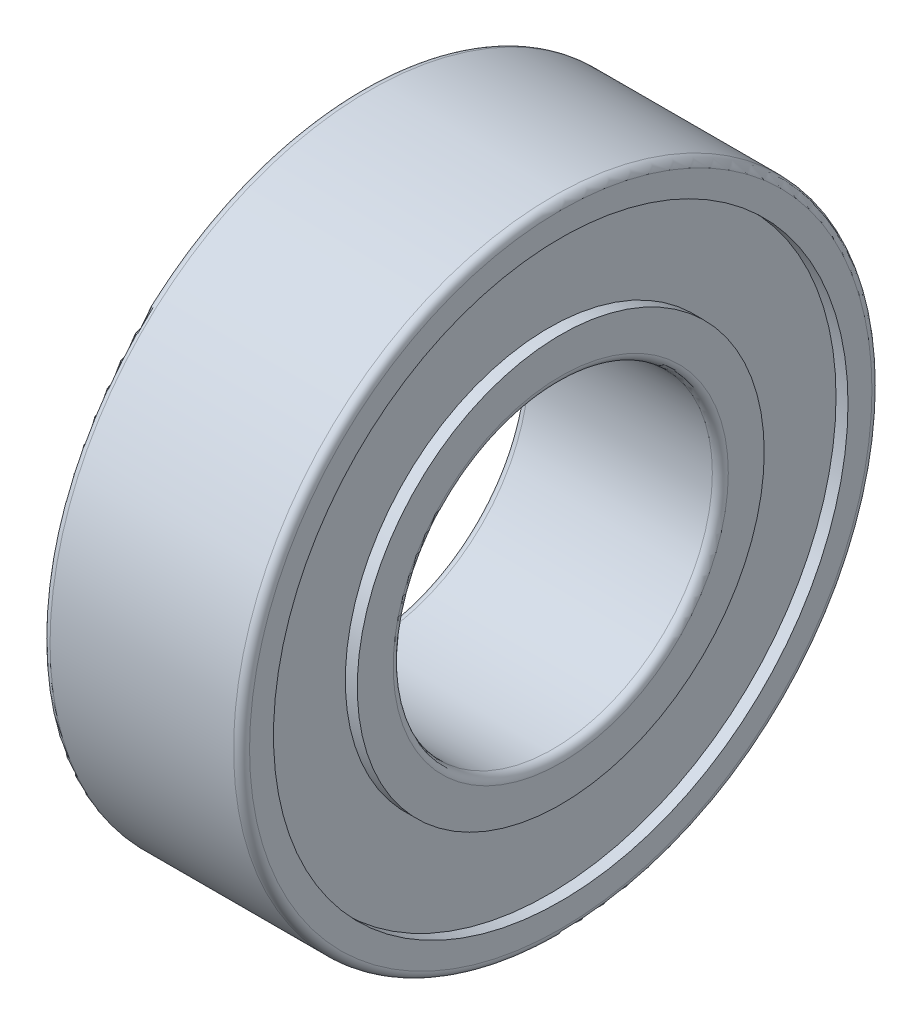
ISO-10303-21;
HEADER;
FILE_DESCRIPTION(('STEP AP214'),'2;1');
FILE_NAME('part.step','',(''),(''),'','','');
FILE_SCHEMA(('AUTOMOTIVE_DESIGN { 1 0 10303 214 1 1 1 1 }'));
ENDSEC;
DATA;
#1=APPLICATION_CONTEXT('core data for automotive mechanical design processes');
#2=APPLICATION_PROTOCOL_DEFINITION('international standard','automotive_design',2000,#1);
#3=PRODUCT_CONTEXT('',#1,'mechanical');
#4=PRODUCT('Part','Part','',(#3));
#5=PRODUCT_RELATED_PRODUCT_CATEGORY('part','',(#4));
#6=PRODUCT_DEFINITION_FORMATION('','',#4);
#7=PRODUCT_DEFINITION_CONTEXT('part definition',#1,'design');
#8=PRODUCT_DEFINITION('design','',#6,#7);
#9=PRODUCT_DEFINITION_SHAPE('','',#8);
#10=(LENGTH_UNIT() NAMED_UNIT(*) SI_UNIT(.MILLI.,.METRE.));
#11=(NAMED_UNIT(*) PLANE_ANGLE_UNIT() SI_UNIT($,.RADIAN.));
#12=(NAMED_UNIT(*) SI_UNIT($,.STERADIAN.) SOLID_ANGLE_UNIT());
#13=UNCERTAINTY_MEASURE_WITH_UNIT(LENGTH_MEASURE(1.E-05),#10,'distance_accuracy_value','');
#14=(GEOMETRIC_REPRESENTATION_CONTEXT(3) GLOBAL_UNCERTAINTY_ASSIGNED_CONTEXT((#13)) GLOBAL_UNIT_ASSIGNED_CONTEXT((#10,
#11,#12)) REPRESENTATION_CONTEXT('',''));
#15=CARTESIAN_POINT('',(0.,0.,0.));
#16=DIRECTION('',(0.,0.,1.));
#17=DIRECTION('',(1.,0.,0.));
#18=AXIS2_PLACEMENT_3D('',#15,#16,#17);
#19=CARTESIAN_POINT('',(-2.5,4.,0.));
#20=DIRECTION('',(-1.,0.,0.));
#21=DIRECTION('',(0.,0.,1.));
#22=AXIS2_PLACEMENT_3D('',#19,#20,#21);
#23=PLANE('',#22);
#24=CARTESIAN_POINT('',(-2.5,0.,0.));
#25=DIRECTION('',(-1.,0.,0.));
#26=DIRECTION('',(0.,0.,1.));
#27=AXIS2_PLACEMENT_3D('',#24,#25,#26);
#28=CIRCLE('',#27,4.2);
#29=CARTESIAN_POINT('',(-2.5,0.,4.2));
#30=VERTEX_POINT('',#29);
#31=EDGE_CURVE('E64',#30,#30,#28,.F.);
#32=ORIENTED_EDGE('',*,*,#31,.T.);
#33=EDGE_LOOP('',(#32));
#34=FACE_BOUND('',#33,.T.);
#35=CARTESIAN_POINT('',(-2.5,0.,0.));
#36=DIRECTION('',(1.,0.,0.));
#37=DIRECTION('',(0.,0.,-1.));
#38=AXIS2_PLACEMENT_3D('',#35,#36,#37);
#39=CIRCLE('',#38,5.1);
#40=CARTESIAN_POINT('',(-2.5,0.,-5.1));
#41=VERTEX_POINT('',#40);
#42=EDGE_CURVE('E67',#41,#41,#39,.T.);
#43=ORIENTED_EDGE('',*,*,#42,.F.);
#44=EDGE_LOOP('',(#43));
#45=FACE_BOUND('',#44,.T.);
#46=ADVANCED_FACE('F35',(#34,#45),#23,.T.);
#47=CARTESIAN_POINT('',(0.,0.,0.));
#48=DIRECTION('',(1.,0.,0.));
#49=DIRECTION('',(0.,0.,-1.));
#50=AXIS2_PLACEMENT_3D('',#47,#48,#49);
#51=CYLINDRICAL_SURFACE('',#50,5.1);
#52=ORIENTED_EDGE('',*,*,#42,.T.);
#53=EDGE_LOOP('',(#52));
#54=FACE_BOUND('',#53,.T.);
#55=CARTESIAN_POINT('',(-2.2,0.,0.));
#56=DIRECTION('',(1.,0.,0.));
#57=DIRECTION('',(0.,0.,-1.));
#58=AXIS2_PLACEMENT_3D('',#55,#56,#57);
#59=CIRCLE('',#58,5.1);
#60=CARTESIAN_POINT('',(-2.2,0.,-5.1));
#61=VERTEX_POINT('',#60);
#62=EDGE_CURVE('E70',#61,#61,#59,.T.);
#63=ORIENTED_EDGE('',*,*,#62,.F.);
#64=EDGE_LOOP('',(#63));
#65=FACE_BOUND('',#64,.T.);
#66=ADVANCED_FACE('F110',(#54,#65),#51,.T.);
#67=CARTESIAN_POINT('',(-2.2,5.1,0.));
#68=DIRECTION('',(-1.,0.,0.));
#69=DIRECTION('',(0.,0.,1.));
#70=AXIS2_PLACEMENT_3D('',#67,#68,#69);
#71=PLANE('',#70);
#72=ORIENTED_EDGE('',*,*,#62,.T.);
#73=EDGE_LOOP('',(#72));
#74=FACE_BOUND('',#73,.T.);
#75=CARTESIAN_POINT('',(-2.2,0.,0.));
#76=DIRECTION('',(1.,0.,0.));
#77=DIRECTION('',(0.,0.,-1.));
#78=AXIS2_PLACEMENT_3D('',#75,#76,#77);
#79=CIRCLE('',#78,7.2);
#80=CARTESIAN_POINT('',(-2.2,0.,-7.2));
#81=VERTEX_POINT('',#80);
#82=EDGE_CURVE('E73',#81,#81,#79,.T.);
#83=ORIENTED_EDGE('',*,*,#82,.F.);
#84=EDGE_LOOP('',(#83));
#85=FACE_BOUND('',#84,.T.);
#86=ADVANCED_FACE('F116',(#74,#85),#71,.T.);
#87=CARTESIAN_POINT('',(0.,0.,0.));
#88=DIRECTION('',(1.,0.,0.));
#89=DIRECTION('',(0.,0.,-1.));
#90=AXIS2_PLACEMENT_3D('',#87,#88,#89);
#91=CYLINDRICAL_SURFACE('',#90,7.2);
#92=ORIENTED_EDGE('',*,*,#82,.T.);
#93=EDGE_LOOP('',(#92));
#94=FACE_BOUND('',#93,.T.);
#95=CARTESIAN_POINT('',(-2.5,0.,0.));
#96=DIRECTION('',(1.,0.,0.));
#97=DIRECTION('',(0.,0.,-1.));
#98=AXIS2_PLACEMENT_3D('',#95,#96,#97);
#99=CIRCLE('',#98,7.2);
#100=CARTESIAN_POINT('',(-2.5,0.,-7.2));
#101=VERTEX_POINT('',#100);
#102=EDGE_CURVE('E76',#101,#101,#99,.T.);
#103=ORIENTED_EDGE('',*,*,#102,.F.);
#104=EDGE_LOOP('',(#103));
#105=FACE_BOUND('',#104,.T.);
#106=ADVANCED_FACE('F152',(#94,#105),#91,.F.);
#107=CARTESIAN_POINT('',(-2.5,7.2,0.));
#108=DIRECTION('',(-1.,0.,0.));
#109=DIRECTION('',(0.,0.,1.));
#110=AXIS2_PLACEMENT_3D('',#107,#108,#109);
#111=PLANE('',#110);
#112=CARTESIAN_POINT('',(-2.5,0.,0.));
#113=DIRECTION('',(-1.,0.,0.));
#114=DIRECTION('',(0.,0.,1.));
#115=AXIS2_PLACEMENT_3D('',#112,#113,#114);
#116=CIRCLE('',#115,7.8);
#117=CARTESIAN_POINT('',(-2.5,0.,7.8));
#118=VERTEX_POINT('',#117);
#119=EDGE_CURVE('E42',#118,#118,#116,.T.);
#120=ORIENTED_EDGE('',*,*,#119,.T.);
#121=EDGE_LOOP('',(#120));
#122=FACE_BOUND('',#121,.T.);
#123=ORIENTED_EDGE('',*,*,#102,.T.);
#124=EDGE_LOOP('',(#123));
#125=FACE_BOUND('',#124,.T.);
#126=ADVANCED_FACE('F143',(#122,#125),#111,.T.);
#127=CARTESIAN_POINT('',(0.,0.,0.));
#128=DIRECTION('',(1.,0.,0.));
#129=DIRECTION('',(0.,0.,-1.));
#130=AXIS2_PLACEMENT_3D('',#127,#128,#129);
#131=CYLINDRICAL_SURFACE('',#130,8.);
#132=CARTESIAN_POINT('',(-2.3,0.,0.));
#133=DIRECTION('',(-1.,0.,0.));
#134=DIRECTION('',(0.,0.,1.));
#135=AXIS2_PLACEMENT_3D('',#132,#133,#134);
#136=CIRCLE('',#135,8.);
#137=CARTESIAN_POINT('',(-2.3,0.,8.));
#138=VERTEX_POINT('',#137);
#139=EDGE_CURVE('E46',#138,#138,#136,.F.);
#140=ORIENTED_EDGE('',*,*,#139,.T.);
#141=EDGE_LOOP('',(#140));
#142=FACE_BOUND('',#141,.T.);
#143=CARTESIAN_POINT('',(2.3,0.,0.));
#144=DIRECTION('',(1.,0.,0.));
#145=DIRECTION('',(0.,0.,-1.));
#146=AXIS2_PLACEMENT_3D('',#143,#144,#145);
#147=CIRCLE('',#146,8.);
#148=CARTESIAN_POINT('',(2.3,0.,-8.));
#149=VERTEX_POINT('',#148);
#150=EDGE_CURVE('E50',#149,#149,#147,.F.);
#151=ORIENTED_EDGE('',*,*,#150,.T.);
#152=EDGE_LOOP('',(#151));
#153=FACE_BOUND('',#152,.T.);
#154=ADVANCED_FACE('F139',(#142,#153),#131,.T.);
#155=CARTESIAN_POINT('',(2.5,7.2,0.));
#156=DIRECTION('',(1.,0.,0.));
#157=DIRECTION('',(0.,0.,-1.));
#158=AXIS2_PLACEMENT_3D('',#155,#156,#157);
#159=PLANE('',#158);
#160=CARTESIAN_POINT('',(2.5,0.,0.));
#161=DIRECTION('',(1.,0.,0.));
#162=DIRECTION('',(0.,0.,-1.));
#163=AXIS2_PLACEMENT_3D('',#160,#161,#162);
#164=CIRCLE('',#163,7.8);
#165=CARTESIAN_POINT('',(2.5,0.,-7.8));
#166=VERTEX_POINT('',#165);
#167=EDGE_CURVE('E10',#166,#166,#164,.T.);
#168=ORIENTED_EDGE('',*,*,#167,.T.);
#169=EDGE_LOOP('',(#168));
#170=FACE_BOUND('',#169,.T.);
#171=CARTESIAN_POINT('',(2.5,0.,0.));
#172=DIRECTION('',(1.,0.,0.));
#173=DIRECTION('',(0.,0.,-1.));
#174=AXIS2_PLACEMENT_3D('',#171,#172,#173);
#175=CIRCLE('',#174,7.2);
#176=CARTESIAN_POINT('',(2.5,0.,-7.2));
#177=VERTEX_POINT('',#176);
#178=EDGE_CURVE('E79',#177,#177,#175,.T.);
#179=ORIENTED_EDGE('',*,*,#178,.F.);
#180=EDGE_LOOP('',(#179));
#181=FACE_BOUND('',#180,.T.);
#182=ADVANCED_FACE('F142',(#170,#181),#159,.T.);
#183=CARTESIAN_POINT('',(0.,0.,0.));
#184=DIRECTION('',(1.,0.,0.));
#185=DIRECTION('',(0.,0.,-1.));
#186=AXIS2_PLACEMENT_3D('',#183,#184,#185);
#187=CYLINDRICAL_SURFACE('',#186,7.2);
#188=ORIENTED_EDGE('',*,*,#178,.T.);
#189=EDGE_LOOP('',(#188));
#190=FACE_BOUND('',#189,.T.);
#191=CARTESIAN_POINT('',(2.2,0.,0.));
#192=DIRECTION('',(1.,0.,0.));
#193=DIRECTION('',(0.,0.,-1.));
#194=AXIS2_PLACEMENT_3D('',#191,#192,#193);
#195=CIRCLE('',#194,7.2);
#196=CARTESIAN_POINT('',(2.2,0.,-7.2));
#197=VERTEX_POINT('',#196);
#198=EDGE_CURVE('E82',#197,#197,#195,.T.);
#199=ORIENTED_EDGE('',*,*,#198,.F.);
#200=EDGE_LOOP('',(#199));
#201=FACE_BOUND('',#200,.T.);
#202=ADVANCED_FACE('F106',(#190,#201),#187,.F.);
#203=CARTESIAN_POINT('',(2.2,5.1,0.));
#204=DIRECTION('',(1.,0.,0.));
#205=DIRECTION('',(0.,0.,-1.));
#206=AXIS2_PLACEMENT_3D('',#203,#204,#205);
#207=PLANE('',#206);
#208=ORIENTED_EDGE('',*,*,#198,.T.);
#209=EDGE_LOOP('',(#208));
#210=FACE_BOUND('',#209,.T.);
#211=CARTESIAN_POINT('',(2.2,0.,0.));
#212=DIRECTION('',(1.,0.,0.));
#213=DIRECTION('',(0.,0.,-1.));
#214=AXIS2_PLACEMENT_3D('',#211,#212,#213);
#215=CIRCLE('',#214,5.1);
#216=CARTESIAN_POINT('',(2.2,0.,-5.1));
#217=VERTEX_POINT('',#216);
#218=EDGE_CURVE('E85',#217,#217,#215,.T.);
#219=ORIENTED_EDGE('',*,*,#218,.F.);
#220=EDGE_LOOP('',(#219));
#221=FACE_BOUND('',#220,.T.);
#222=ADVANCED_FACE('F96',(#210,#221),#207,.T.);
#223=CARTESIAN_POINT('',(0.,0.,0.));
#224=DIRECTION('',(1.,0.,0.));
#225=DIRECTION('',(0.,0.,-1.));
#226=AXIS2_PLACEMENT_3D('',#223,#224,#225);
#227=CYLINDRICAL_SURFACE('',#226,5.1);
#228=ORIENTED_EDGE('',*,*,#218,.T.);
#229=EDGE_LOOP('',(#228));
#230=FACE_BOUND('',#229,.T.);
#231=CARTESIAN_POINT('',(2.5,0.,0.));
#232=DIRECTION('',(1.,0.,0.));
#233=DIRECTION('',(0.,0.,-1.));
#234=AXIS2_PLACEMENT_3D('',#231,#232,#233);
#235=CIRCLE('',#234,5.1);
#236=CARTESIAN_POINT('',(2.5,0.,-5.1));
#237=VERTEX_POINT('',#236);
#238=EDGE_CURVE('E88',#237,#237,#235,.T.);
#239=ORIENTED_EDGE('',*,*,#238,.F.);
#240=EDGE_LOOP('',(#239));
#241=FACE_BOUND('',#240,.T.);
#242=ADVANCED_FACE('F94',(#230,#241),#227,.T.);
#243=CARTESIAN_POINT('',(2.5,4.,0.));
#244=DIRECTION('',(1.,0.,0.));
#245=DIRECTION('',(0.,0.,-1.));
#246=AXIS2_PLACEMENT_3D('',#243,#244,#245);
#247=PLANE('',#246);
#248=CARTESIAN_POINT('',(2.5,0.,0.));
#249=DIRECTION('',(1.,0.,0.));
#250=DIRECTION('',(0.,0.,-1.));
#251=AXIS2_PLACEMENT_3D('',#248,#249,#250);
#252=CIRCLE('',#251,4.2);
#253=CARTESIAN_POINT('',(2.5,0.,-4.2));
#254=VERTEX_POINT('',#253);
#255=EDGE_CURVE('E55',#254,#254,#252,.F.);
#256=ORIENTED_EDGE('',*,*,#255,.T.);
#257=EDGE_LOOP('',(#256));
#258=FACE_BOUND('',#257,.T.);
#259=ORIENTED_EDGE('',*,*,#238,.T.);
#260=EDGE_LOOP('',(#259));
#261=FACE_BOUND('',#260,.T.);
#262=ADVANCED_FACE('F92',(#258,#261),#247,.T.);
#263=CARTESIAN_POINT('',(0.,0.,0.));
#264=DIRECTION('',(1.,0.,0.));
#265=DIRECTION('',(0.,0.,-1.));
#266=AXIS2_PLACEMENT_3D('',#263,#264,#265);
#267=CYLINDRICAL_SURFACE('',#266,4.);
#268=CARTESIAN_POINT('',(-2.3,0.,0.));
#269=DIRECTION('',(-1.,0.,0.));
#270=DIRECTION('',(0.,0.,1.));
#271=AXIS2_PLACEMENT_3D('',#268,#269,#270);
#272=CIRCLE('',#271,4.);
#273=CARTESIAN_POINT('',(-2.3,0.,4.));
#274=VERTEX_POINT('',#273);
#275=EDGE_CURVE('E58',#274,#274,#272,.T.);
#276=ORIENTED_EDGE('',*,*,#275,.T.);
#277=EDGE_LOOP('',(#276));
#278=FACE_BOUND('',#277,.T.);
#279=CARTESIAN_POINT('',(2.3,0.,0.));
#280=DIRECTION('',(1.,0.,0.));
#281=DIRECTION('',(0.,0.,-1.));
#282=AXIS2_PLACEMENT_3D('',#279,#280,#281);
#283=CIRCLE('',#282,4.);
#284=CARTESIAN_POINT('',(2.3,0.,-4.));
#285=VERTEX_POINT('',#284);
#286=EDGE_CURVE('E61',#285,#285,#283,.T.);
#287=ORIENTED_EDGE('',*,*,#286,.T.);
#288=EDGE_LOOP('',(#287));
#289=FACE_BOUND('',#288,.T.);
#290=ADVANCED_FACE('F103',(#278,#289),#267,.F.);
#291=CARTESIAN_POINT('',(-2.3,0.,0.));
#292=DIRECTION('',(-1.,0.,0.));
#293=DIRECTION('',(0.,0.,1.));
#294=AXIS2_PLACEMENT_3D('',#291,#292,#293);
#295=TOROIDAL_SURFACE('',#294,4.2,0.2);
#296=ORIENTED_EDGE('',*,*,#275,.F.);
#297=EDGE_LOOP('',(#296));
#298=FACE_BOUND('',#297,.T.);
#299=ORIENTED_EDGE('',*,*,#31,.F.);
#300=EDGE_LOOP('',(#299));
#301=FACE_BOUND('',#300,.T.);
#302=ADVANCED_FACE('F122',(#298,#301),#295,.T.);
#303=CARTESIAN_POINT('',(2.3,0.,0.));
#304=DIRECTION('',(1.,0.,0.));
#305=DIRECTION('',(0.,0.,-1.));
#306=AXIS2_PLACEMENT_3D('',#303,#304,#305);
#307=TOROIDAL_SURFACE('',#306,4.2,0.2);
#308=ORIENTED_EDGE('',*,*,#255,.F.);
#309=EDGE_LOOP('',(#308));
#310=FACE_BOUND('',#309,.T.);
#311=ORIENTED_EDGE('',*,*,#286,.F.);
#312=EDGE_LOOP('',(#311));
#313=FACE_BOUND('',#312,.T.);
#314=ADVANCED_FACE('F125',(#310,#313),#307,.T.);
#315=CARTESIAN_POINT('',(-2.3,0.,0.));
#316=DIRECTION('',(-1.,0.,0.));
#317=DIRECTION('',(0.,0.,1.));
#318=AXIS2_PLACEMENT_3D('',#315,#316,#317);
#319=TOROIDAL_SURFACE('',#318,7.8,0.2);
#320=ORIENTED_EDGE('',*,*,#119,.F.);
#321=EDGE_LOOP('',(#320));
#322=FACE_BOUND('',#321,.T.);
#323=ORIENTED_EDGE('',*,*,#139,.F.);
#324=EDGE_LOOP('',(#323));
#325=FACE_BOUND('',#324,.T.);
#326=ADVANCED_FACE('F128',(#322,#325),#319,.T.);
#327=CARTESIAN_POINT('',(2.3,0.,0.));
#328=DIRECTION('',(1.,0.,0.));
#329=DIRECTION('',(0.,0.,-1.));
#330=AXIS2_PLACEMENT_3D('',#327,#328,#329);
#331=TOROIDAL_SURFACE('',#330,7.8,0.2);
#332=ORIENTED_EDGE('',*,*,#150,.F.);
#333=EDGE_LOOP('',(#332));
#334=FACE_BOUND('',#333,.T.);
#335=ORIENTED_EDGE('',*,*,#167,.F.);
#336=EDGE_LOOP('',(#335));
#337=FACE_BOUND('',#336,.T.);
#338=ADVANCED_FACE('F37',(#334,#337),#331,.T.);
#339=CLOSED_SHELL('',(#46,#66,#86,#106,#126,#154,#182,#202,#222,#242,#262,#290,#302,#314,#326,#338));
#340=MANIFOLD_SOLID_BREP('B2',#339);
#341=ADVANCED_BREP_SHAPE_REPRESENTATION('',(#18,#340),#14);
#342=SHAPE_DEFINITION_REPRESENTATION(#9,#341);
ENDSEC;
END-ISO-10303-21;
